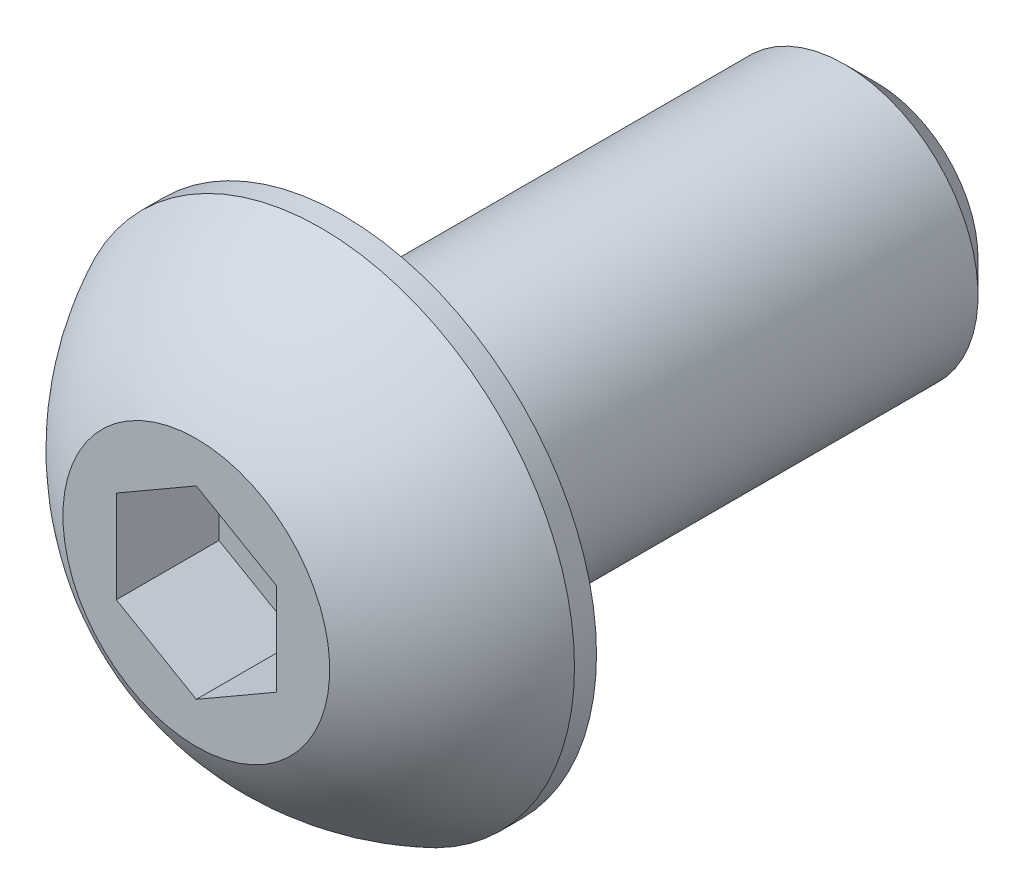
ISO-10303-21;
HEADER;
FILE_DESCRIPTION(('STEP AP214'),'2;1');
FILE_NAME('part.step','',(''),(''),'','','');
FILE_SCHEMA(('AUTOMOTIVE_DESIGN { 1 0 10303 214 1 1 1 1 }'));
ENDSEC;
DATA;
#1=APPLICATION_CONTEXT('core data for automotive mechanical design processes');
#2=APPLICATION_PROTOCOL_DEFINITION('international standard','automotive_design',2000,#1);
#3=PRODUCT_CONTEXT('',#1,'mechanical');
#4=PRODUCT('Part','Part','',(#3));
#5=PRODUCT_RELATED_PRODUCT_CATEGORY('part','',(#4));
#6=PRODUCT_DEFINITION_FORMATION('','',#4);
#7=PRODUCT_DEFINITION_CONTEXT('part definition',#1,'design');
#8=PRODUCT_DEFINITION('design','',#6,#7);
#9=PRODUCT_DEFINITION_SHAPE('','',#8);
#10=(LENGTH_UNIT() NAMED_UNIT(*) SI_UNIT(.MILLI.,.METRE.));
#11=(NAMED_UNIT(*) PLANE_ANGLE_UNIT() SI_UNIT($,.RADIAN.));
#12=(NAMED_UNIT(*) SI_UNIT($,.STERADIAN.) SOLID_ANGLE_UNIT());
#13=UNCERTAINTY_MEASURE_WITH_UNIT(LENGTH_MEASURE(1.E-05),#10,'distance_accuracy_value','');
#14=(GEOMETRIC_REPRESENTATION_CONTEXT(3) GLOBAL_UNCERTAINTY_ASSIGNED_CONTEXT((#13)) GLOBAL_UNIT_ASSIGNED_CONTEXT((#10,
#11,#12)) REPRESENTATION_CONTEXT('',''));
#15=CARTESIAN_POINT('',(0.,0.,0.));
#16=DIRECTION('',(0.,0.,1.));
#17=DIRECTION('',(1.,0.,0.));
#18=AXIS2_PLACEMENT_3D('',#15,#16,#17);
#19=CARTESIAN_POINT('',(0.,-2.5,-12.75));
#20=DIRECTION('',(0.,0.,-1.));
#21=DIRECTION('',(0.,1.,0.));
#22=AXIS2_PLACEMENT_3D('',#19,#20,#21);
#23=PLANE('',#22);
#24=CARTESIAN_POINT('',(0.,0.,-12.75));
#25=DIRECTION('',(0.,0.,-1.));
#26=DIRECTION('',(0.,1.,0.));
#27=AXIS2_PLACEMENT_3D('',#24,#25,#26);
#28=CIRCLE('',#27,1.9);
#29=CARTESIAN_POINT('',(0.,1.9,-12.75));
#30=VERTEX_POINT('',#29);
#31=EDGE_CURVE('E44',#30,#30,#28,.T.);
#32=ORIENTED_EDGE('',*,*,#31,.T.);
#33=EDGE_LOOP('',(#32));
#34=FACE_BOUND('',#33,.T.);
#35=ADVANCED_FACE('F36',(#34),#23,.T.);
#36=CARTESIAN_POINT('',(0.,0.,-12.75));
#37=DIRECTION('',(0.,0.,-1.));
#38=DIRECTION('',(0.,1.,0.));
#39=AXIS2_PLACEMENT_3D('',#36,#37,#38);
#40=CYLINDRICAL_SURFACE('',#39,2.5);
#41=CARTESIAN_POINT('',(0.,0.,-12.15));
#42=DIRECTION('',(0.,0.,-1.));
#43=DIRECTION('',(0.,1.,0.));
#44=AXIS2_PLACEMENT_3D('',#41,#42,#43);
#45=CIRCLE('',#44,2.5);
#46=CARTESIAN_POINT('',(0.,2.5,-12.15));
#47=VERTEX_POINT('',#46);
#48=EDGE_CURVE('E11',#47,#47,#45,.F.);
#49=ORIENTED_EDGE('',*,*,#48,.T.);
#50=EDGE_LOOP('',(#49));
#51=FACE_BOUND('',#50,.T.);
#52=CARTESIAN_POINT('',(0.,0.,-2.75));
#53=DIRECTION('',(0.,0.,1.));
#54=DIRECTION('',(1.,0.,0.));
#55=AXIS2_PLACEMENT_3D('',#52,#53,#54);
#56=CIRCLE('',#55,2.5);
#57=CARTESIAN_POINT('',(2.5,0.,-2.75));
#58=VERTEX_POINT('',#57);
#59=EDGE_CURVE('E152',#58,#58,#56,.F.);
#60=ORIENTED_EDGE('',*,*,#59,.T.);
#61=EDGE_LOOP('',(#60));
#62=FACE_BOUND('',#61,.T.);
#63=ADVANCED_FACE('F160',(#51,#62),#40,.T.);
#64=CARTESIAN_POINT('',(0.,0.,-12.75));
#65=DIRECTION('',(0.,0.,1.));
#66=DIRECTION('',(0.,-1.,0.));
#67=AXIS2_PLACEMENT_3D('',#64,#65,#66);
#68=CONICAL_SURFACE('',#67,1.9,0.785398163397447);
#69=ORIENTED_EDGE('',*,*,#48,.F.);
#70=EDGE_LOOP('',(#69));
#71=FACE_BOUND('',#70,.T.);
#72=ORIENTED_EDGE('',*,*,#31,.F.);
#73=EDGE_LOOP('',(#72));
#74=FACE_BOUND('',#73,.T.);
#75=ADVANCED_FACE('F38',(#71,#74),#68,.T.);
#76=CARTESIAN_POINT('',(0.,0.,-4.65805481283422));
#77=DIRECTION('',(0.,0.,1.));
#78=DIRECTION('',(0.,-1.,0.));
#79=AXIS2_PLACEMENT_3D('',#76,#77,#78);
#80=SPHERICAL_SURFACE('',#79,5.28653711226622);
#81=CARTESIAN_POINT('',(0.,0.,0.));
#82=DIRECTION('',(0.,0.,1.));
#83=DIRECTION('',(1.,0.,0.));
#84=AXIS2_PLACEMENT_3D('',#81,#82,#83);
#85=CIRCLE('',#84,2.5);
#86=CARTESIAN_POINT('',(0.,-2.5,0.));
#87=VERTEX_POINT('',#86);
#88=EDGE_CURVE('E149',#87,#87,#85,.T.);
#89=CARTESIAN_POINT('',(0.,0.,-2.3375));
#90=DIRECTION('',(0.,0.,1.));
#91=DIRECTION('',(1.,0.,0.));
#92=AXIS2_PLACEMENT_3D('',#89,#90,#91);
#93=CIRCLE('',#92,4.75);
#94=CARTESIAN_POINT('',(0.,-4.75,-2.3375));
#95=VERTEX_POINT('',#94);
#96=EDGE_CURVE('E138',#95,#95,#93,.T.);
#97=CARTESIAN_POINT('',(0.,-2.5,0.));
#98=CARTESIAN_POINT('',(0.,-2.53026679982017,-0.016244282455609));
#99=CARTESIAN_POINT('',(0.,-2.56037522904968,-0.0327836412064128));
#100=CARTESIAN_POINT('',(0.,-2.62026400427657,-0.0664460518821871));
#101=CARTESIAN_POINT('',(0.,-2.65004435027396,-0.0835691038071575));
#102=CARTESIAN_POINT('',(0.,-2.70926561698584,-0.11839244141504));
#103=CARTESIAN_POINT('',(0.,-2.73870653770032,-0.136092727097952));
#104=CARTESIAN_POINT('',(0.,-2.79723777417103,-0.172063794044945));
#105=CARTESIAN_POINT('',(0.,-2.82632808992726,-0.190334575309027));
#106=CARTESIAN_POINT('',(0.,-2.8841470610759,-0.227439694392676));
#107=CARTESIAN_POINT('',(0.,-2.91287571646831,-0.246274032212244));
#108=CARTESIAN_POINT('',(0.,-2.96996045130294,-0.284499106978588));
#109=CARTESIAN_POINT('',(0.,-2.99831653074515,-0.303889843925365));
#110=CARTESIAN_POINT('',(0.,-3.05464533901892,-0.343220349244854));
#111=CARTESIAN_POINT('',(0.,-3.08261806785047,-0.363160117617566));
#112=CARTESIAN_POINT('',(0.,-3.13816954607727,-0.403581109164589));
#113=CARTESIAN_POINT('',(0.,-3.16574829547251,-0.424062332338901));
#114=CARTESIAN_POINT('',(0.,-3.22050133565615,-0.465558451209038));
#115=CARTESIAN_POINT('',(0.,-3.24767562644455,-0.486573346904865));
#116=CARTESIAN_POINT('',(0.,-3.30160942393942,-0.529128825735185));
#117=CARTESIAN_POINT('',(0.,-3.32836893064589,-0.550669408869678));
#118=CARTESIAN_POINT('',(0.,-3.38146299210494,-0.594268077753708));
#119=CARTESIAN_POINT('',(0.,-3.40779754685753,-0.616326163503246));
#120=CARTESIAN_POINT('',(0.,-3.46003169800773,-0.660951456155511));
#121=CARTESIAN_POINT('',(0.,-3.48593129440535,-0.683518663058237));
#122=CARTESIAN_POINT('',(0.,-3.53728568771641,-0.729153623103509));
#123=CARTESIAN_POINT('',(0.,-3.56274048462986,-0.752221376246055));
#124=CARTESIAN_POINT('',(0.,-3.61319560685493,-0.798848663663778));
#125=CARTESIAN_POINT('',(0.,-3.63819593216655,-0.822408197938956));
#126=CARTESIAN_POINT('',(0.,-3.68773261175691,-0.870010095651582));
#127=CARTESIAN_POINT('',(0.,-3.71226896603565,-0.89405245908903));
#128=CARTESIAN_POINT('',(0.,-3.76086838042534,-0.942610879694118));
#129=CARTESIAN_POINT('',(0.,-3.78493144053629,-0.967126936861757));
#130=CARTESIAN_POINT('',(0.,-3.83257512329416,-1.01662342950466));
#131=CARTESIAN_POINT('',(0.,-3.85615574594108,-1.04160386497992));
#132=CARTESIAN_POINT('',(0.,-3.90282559378753,-1.0920196223646));
#133=CARTESIAN_POINT('',(0.,-3.92591481898706,-1.11745494427402));
#134=CARTESIAN_POINT('',(0.,-3.97159309867276,-1.1687708098093));
#135=CARTESIAN_POINT('',(0.,-3.99418215315894,-1.19465135343517));
#136=CARTESIAN_POINT('',(0.,-4.03885150820303,-1.24684782851373));
#137=CARTESIAN_POINT('',(0.,-4.06093180876094,-1.27316375996643));
#138=CARTESIAN_POINT('',(0.,-4.10457526604591,-1.32622101137371));
#139=CARTESIAN_POINT('',(0.,-4.12613842277298,-1.3529623313283));
#140=CARTESIAN_POINT('',(0.,-4.16873939899418,-1.40686019877854));
#141=CARTESIAN_POINT('',(0.,-4.1897772184883,-1.4340167462742));
#142=CARTESIAN_POINT('',(0.,-4.23131952645464,-1.488734750071));
#143=CARTESIAN_POINT('',(0.,-4.25182401492686,-1.51629620637214));
#144=CARTESIAN_POINT('',(0.,-4.29229186971308,-1.5718135551894));
#145=CARTESIAN_POINT('',(0.,-4.31225523602708,-1.59976944770551));
#146=CARTESIAN_POINT('',(0.,-4.35163326096594,-1.65606504649041));
#147=CARTESIAN_POINT('',(0.,-4.3710479195908,-1.6844047527592));
#148=CARTESIAN_POINT('',(0.,-4.40932115213664,-1.74145721073709));
#149=CARTESIAN_POINT('',(0.,-4.42817972605763,-1.77016996244618));
#150=CARTESIAN_POINT('',(0.,-4.46533362339398,-1.82795760128832));
#151=CARTESIAN_POINT('',(0.,-4.48362894680934,-1.85703248842136));
#152=CARTESIAN_POINT('',(0.,-4.51964939166499,-1.91553335033324));
#153=CARTESIAN_POINT('',(0.,-4.53737451310527,-1.94495932511208));
#154=CARTESIAN_POINT('',(0.,-4.57224781803529,-2.00415118173237));
#155=CARTESIAN_POINT('',(0.,-4.58939600152503,-2.03391706357382));
#156=CARTESIAN_POINT('',(0.,-4.62310891815402,-2.09377742234707));
#157=CARTESIAN_POINT('',(0.,-4.63967365129327,-2.12387189927887));
#158=CARTESIAN_POINT('',(0.,-4.67221336026297,-2.18437801974018));
#159=CARTESIAN_POINT('',(0.,-4.68818833609342,-2.21478966326969));
#160=CARTESIAN_POINT('',(0.,-4.71954250823692,-2.27591853680649));
#161=CARTESIAN_POINT('',(0.,-4.73492170454996,-2.30663576681378));
#162=CARTESIAN_POINT('',(0.,-4.75,-2.3375));
#163=B_SPLINE_CURVE_WITH_KNOTS('',3,(#97,#98,#99,#100,#101,#102,#103,#104,#105,#106,#107,#108,
#109,#110,#111,#112,#113,#114,#115,#116,#117,#118,#119,#120,#121,#122,#123,#124,#125,#126,#127,
#128,#129,#130,#131,#132,#133,#134,#135,#136,#137,#138,#139,#140,#141,#142,#143,#144,#145,#146,
#147,#148,#149,#150,#151,#152,#153,#154,#155,#156,#157,#158,#159,#160,#161,#162),.UNSPECIFIED.,
.F.,.F.,(4,2,2,2,2,2,2,2,2,2,2,2,2,2,2,2,2,2,2,2,2,2,2,2,2,2,2,2,2,2,2,2,4),(0.,
0.10304982363783,0.206099647275662,0.309149470913491,0.412199294551322,0.515249118189152,
0.618298941826983,0.721348765464812,0.824398589102643,0.927448412740473,1.0304982363783,
1.13354806001613,1.23659788365396,1.33964770729179,1.44269753092962,1.54574735456745,
1.64879717820529,1.75184700184312,1.85489682548095,1.95794664911878,2.06099647275661,
2.16404629639444,2.26709612003227,2.3701459436701,2.47319576730793,2.57624559094576,
2.67929541458359,2.78234523822142,2.88539506185925,2.98844488549708,3.09149470913491,
3.19454453277274,3.29759435641057),.UNSPECIFIED.);
#164=EDGE_CURVE('BSEAM159',#87,#95,#163,.T.);
#165=ORIENTED_EDGE('',*,*,#88,.F.);
#166=ORIENTED_EDGE('',*,*,#96,.T.);
#167=ORIENTED_EDGE('',*,*,#164,.T.);
#168=ORIENTED_EDGE('',*,*,#164,.F.);
#169=EDGE_LOOP('',(#165,#167,#166,#168));
#170=FACE_BOUND('',#169,.T.);
#171=ADVANCED_FACE('F159',(#170),#80,.T.);
#172=CARTESIAN_POINT('',(0.,-2.5,0.));
#173=DIRECTION('',(0.,0.,-1.));
#174=DIRECTION('',(-1.,0.,0.));
#175=AXIS2_PLACEMENT_3D('',#172,#173,#174);
#176=PLANE('',#175);
#177=DIRECTION('',(0.,1.,0.));
#178=VECTOR('',#177,1.);
#179=CARTESIAN_POINT('',(1.5,-0.866025403784438,0.));
#180=LINE('',#179,#178);
#181=CARTESIAN_POINT('',(1.5,-0.866025403784439,0.));
#182=VERTEX_POINT('',#181);
#183=CARTESIAN_POINT('',(1.5,0.866025403784439,0.));
#184=VERTEX_POINT('',#183);
#185=EDGE_CURVE('E125',#182,#184,#180,.T.);
#186=ORIENTED_EDGE('',*,*,#185,.F.);
#187=DIRECTION('',(0.866025403784438,0.5,0.));
#188=VECTOR('',#187,1.);
#189=CARTESIAN_POINT('',(0.,-1.73205080756888,0.));
#190=LINE('',#189,#188);
#191=CARTESIAN_POINT('',(0.,-1.73205080756888,0.));
#192=VERTEX_POINT('',#191);
#193=EDGE_CURVE('E51',#192,#182,#190,.T.);
#194=ORIENTED_EDGE('',*,*,#193,.F.);
#195=DIRECTION('',(0.866025403784439,-0.5,0.));
#196=VECTOR('',#195,1.);
#197=CARTESIAN_POINT('',(-1.5,-0.866025403784439,0.));
#198=LINE('',#197,#196);
#199=CARTESIAN_POINT('',(-1.5,-0.866025403784439,0.));
#200=VERTEX_POINT('',#199);
#201=EDGE_CURVE('E134',#200,#192,#198,.T.);
#202=ORIENTED_EDGE('',*,*,#201,.F.);
#203=DIRECTION('',(0.,-1.,0.));
#204=VECTOR('',#203,1.);
#205=CARTESIAN_POINT('',(-1.5,0.866025403784438,0.));
#206=LINE('',#205,#204);
#207=CARTESIAN_POINT('',(-1.5,0.866025403784438,0.));
#208=VERTEX_POINT('',#207);
#209=EDGE_CURVE('E132',#208,#200,#206,.T.);
#210=ORIENTED_EDGE('',*,*,#209,.F.);
#211=DIRECTION('',(-0.866025403784438,-0.5,0.));
#212=VECTOR('',#211,1.);
#213=CARTESIAN_POINT('',(0.,1.73205080756888,0.));
#214=LINE('',#213,#212);
#215=CARTESIAN_POINT('',(0.,1.73205080756888,0.));
#216=VERTEX_POINT('',#215);
#217=EDGE_CURVE('E99',#216,#208,#214,.T.);
#218=ORIENTED_EDGE('',*,*,#217,.F.);
#219=DIRECTION('',(-0.866025403784439,0.5,0.));
#220=VECTOR('',#219,1.);
#221=CARTESIAN_POINT('',(1.5,0.866025403784439,0.));
#222=LINE('',#221,#220);
#223=EDGE_CURVE('E128',#184,#216,#222,.T.);
#224=ORIENTED_EDGE('',*,*,#223,.F.);
#225=EDGE_LOOP('',(#186,#194,#202,#210,#218,#224));
#226=FACE_BOUND('',#225,.T.);
#227=ORIENTED_EDGE('',*,*,#88,.T.);
#228=EDGE_LOOP('',(#227));
#229=FACE_BOUND('',#228,.T.);
#230=ADVANCED_FACE('F166',(#226,#229),#176,.F.);
#231=CARTESIAN_POINT('',(0.,-4.75,-2.75));
#232=DIRECTION('',(0.,0.,1.));
#233=DIRECTION('',(1.,0.,0.));
#234=AXIS2_PLACEMENT_3D('',#231,#232,#233);
#235=PLANE('',#234);
#236=ORIENTED_EDGE('',*,*,#59,.F.);
#237=EDGE_LOOP('',(#236));
#238=FACE_BOUND('',#237,.T.);
#239=CARTESIAN_POINT('',(0.,0.,-2.75));
#240=DIRECTION('',(0.,0.,1.));
#241=DIRECTION('',(1.,0.,0.));
#242=AXIS2_PLACEMENT_3D('',#239,#240,#241);
#243=CIRCLE('',#242,4.75);
#244=CARTESIAN_POINT('',(4.75,0.,-2.75));
#245=VERTEX_POINT('',#244);
#246=EDGE_CURVE('E146',#245,#245,#243,.T.);
#247=ORIENTED_EDGE('',*,*,#246,.F.);
#248=EDGE_LOOP('',(#247));
#249=FACE_BOUND('',#248,.T.);
#250=ADVANCED_FACE('F178',(#238,#249),#235,.F.);
#251=CARTESIAN_POINT('',(0.,0.,0.));
#252=DIRECTION('',(0.,0.,1.));
#253=DIRECTION('',(1.,0.,0.));
#254=AXIS2_PLACEMENT_3D('',#251,#252,#253);
#255=CYLINDRICAL_SURFACE('',#254,4.75);
#256=ORIENTED_EDGE('',*,*,#96,.F.);
#257=EDGE_LOOP('',(#256));
#258=FACE_BOUND('',#257,.T.);
#259=ORIENTED_EDGE('',*,*,#246,.T.);
#260=EDGE_LOOP('',(#259));
#261=FACE_BOUND('',#260,.T.);
#262=ADVANCED_FACE('F182',(#258,#261),#255,.T.);
#263=CARTESIAN_POINT('',(0.,-1.73205080756888,-1.925));
#264=DIRECTION('',(0.5,-0.866025403784438,0.));
#265=DIRECTION('',(0.866025403784438,0.5,0.));
#266=AXIS2_PLACEMENT_3D('',#263,#264,#265);
#267=PLANE('',#266);
#268=ORIENTED_EDGE('',*,*,#193,.T.);
#269=DIRECTION('',(0.,0.,1.));
#270=VECTOR('',#269,1.);
#271=CARTESIAN_POINT('',(1.5,-0.866025403784438,-1.925));
#272=LINE('',#271,#270);
#273=CARTESIAN_POINT('',(1.5,-0.866025403784438,-1.925));
#274=VERTEX_POINT('',#273);
#275=EDGE_CURVE('E81',#274,#182,#272,.T.);
#276=ORIENTED_EDGE('',*,*,#275,.F.);
#277=DIRECTION('',(0.866025403784438,0.5,0.));
#278=VECTOR('',#277,1.);
#279=CARTESIAN_POINT('',(0.,-1.73205080756888,-1.925));
#280=LINE('',#279,#278);
#281=CARTESIAN_POINT('',(0.,-1.73205080756888,-1.925));
#282=VERTEX_POINT('',#281);
#283=EDGE_CURVE('E136',#282,#274,#280,.T.);
#284=ORIENTED_EDGE('',*,*,#283,.F.);
#285=DIRECTION('',(0.,0.,1.));
#286=VECTOR('',#285,1.);
#287=CARTESIAN_POINT('',(0.,-1.73205080756888,-1.925));
#288=LINE('',#287,#286);
#289=EDGE_CURVE('E59',#282,#192,#288,.T.);
#290=ORIENTED_EDGE('',*,*,#289,.T.);
#291=EDGE_LOOP('',(#268,#276,#284,#290));
#292=FACE_BOUND('',#291,.T.);
#293=ADVANCED_FACE('F186',(#292),#267,.F.);
#294=CARTESIAN_POINT('',(-1.5,-0.866025403784439,-1.925));
#295=DIRECTION('',(-0.5,-0.866025403784439,0.));
#296=DIRECTION('',(0.866025403784439,-0.5,0.));
#297=AXIS2_PLACEMENT_3D('',#294,#295,#296);
#298=PLANE('',#297);
#299=ORIENTED_EDGE('',*,*,#201,.T.);
#300=ORIENTED_EDGE('',*,*,#289,.F.);
#301=DIRECTION('',(0.866025403784439,-0.5,0.));
#302=VECTOR('',#301,1.);
#303=CARTESIAN_POINT('',(-1.5,-0.866025403784439,-1.925));
#304=LINE('',#303,#302);
#305=CARTESIAN_POINT('',(-1.5,-0.866025403784439,-1.925));
#306=VERTEX_POINT('',#305);
#307=EDGE_CURVE('E111',#306,#282,#304,.T.);
#308=ORIENTED_EDGE('',*,*,#307,.F.);
#309=DIRECTION('',(0.,0.,1.));
#310=VECTOR('',#309,1.);
#311=CARTESIAN_POINT('',(-1.5,-0.866025403784439,-1.925));
#312=LINE('',#311,#310);
#313=EDGE_CURVE('E103',#306,#200,#312,.T.);
#314=ORIENTED_EDGE('',*,*,#313,.T.);
#315=EDGE_LOOP('',(#299,#300,#308,#314));
#316=FACE_BOUND('',#315,.T.);
#317=ADVANCED_FACE('F190',(#316),#298,.F.);
#318=CARTESIAN_POINT('',(-1.5,0.866025403784438,-1.925));
#319=DIRECTION('',(-1.,0.,0.));
#320=DIRECTION('',(0.,0.,1.));
#321=AXIS2_PLACEMENT_3D('',#318,#319,#320);
#322=PLANE('',#321);
#323=ORIENTED_EDGE('',*,*,#209,.T.);
#324=ORIENTED_EDGE('',*,*,#313,.F.);
#325=DIRECTION('',(0.,-1.,0.));
#326=VECTOR('',#325,1.);
#327=CARTESIAN_POINT('',(-1.5,0.866025403784438,-1.925));
#328=LINE('',#327,#326);
#329=CARTESIAN_POINT('',(-1.5,0.866025403784438,-1.925));
#330=VERTEX_POINT('',#329);
#331=EDGE_CURVE('E107',#330,#306,#328,.T.);
#332=ORIENTED_EDGE('',*,*,#331,.F.);
#333=DIRECTION('',(0.,0.,1.));
#334=VECTOR('',#333,1.);
#335=CARTESIAN_POINT('',(-1.5,0.866025403784438,-1.925));
#336=LINE('',#335,#334);
#337=EDGE_CURVE('E92',#330,#208,#336,.T.);
#338=ORIENTED_EDGE('',*,*,#337,.T.);
#339=EDGE_LOOP('',(#323,#324,#332,#338));
#340=FACE_BOUND('',#339,.T.);
#341=ADVANCED_FACE('F108',(#340),#322,.F.);
#342=CARTESIAN_POINT('',(0.,1.73205080756888,-1.925));
#343=DIRECTION('',(-0.5,0.866025403784438,0.));
#344=DIRECTION('',(-0.866025403784438,-0.5,0.));
#345=AXIS2_PLACEMENT_3D('',#342,#343,#344);
#346=PLANE('',#345);
#347=ORIENTED_EDGE('',*,*,#217,.T.);
#348=ORIENTED_EDGE('',*,*,#337,.F.);
#349=DIRECTION('',(-0.866025403784438,-0.5,0.));
#350=VECTOR('',#349,1.);
#351=CARTESIAN_POINT('',(0.,1.73205080756888,-1.925));
#352=LINE('',#351,#350);
#353=CARTESIAN_POINT('',(0.,1.73205080756888,-1.925));
#354=VERTEX_POINT('',#353);
#355=EDGE_CURVE('E96',#354,#330,#352,.T.);
#356=ORIENTED_EDGE('',*,*,#355,.F.);
#357=DIRECTION('',(0.,0.,1.));
#358=VECTOR('',#357,1.);
#359=CARTESIAN_POINT('',(0.,1.73205080756888,-1.925));
#360=LINE('',#359,#358);
#361=EDGE_CURVE('E104',#354,#216,#360,.T.);
#362=ORIENTED_EDGE('',*,*,#361,.T.);
#363=EDGE_LOOP('',(#347,#348,#356,#362));
#364=FACE_BOUND('',#363,.T.);
#365=ADVANCED_FACE('F94',(#364),#346,.F.);
#366=CARTESIAN_POINT('',(1.5,0.866025403784439,-1.925));
#367=DIRECTION('',(0.5,0.866025403784439,0.));
#368=DIRECTION('',(-0.866025403784439,0.5,0.));
#369=AXIS2_PLACEMENT_3D('',#366,#367,#368);
#370=PLANE('',#369);
#371=ORIENTED_EDGE('',*,*,#223,.T.);
#372=ORIENTED_EDGE('',*,*,#361,.F.);
#373=DIRECTION('',(-0.866025403784439,0.5,0.));
#374=VECTOR('',#373,1.);
#375=CARTESIAN_POINT('',(1.5,0.866025403784439,-1.925));
#376=LINE('',#375,#374);
#377=CARTESIAN_POINT('',(1.5,0.866025403784439,-1.925));
#378=VERTEX_POINT('',#377);
#379=EDGE_CURVE('E117',#378,#354,#376,.T.);
#380=ORIENTED_EDGE('',*,*,#379,.F.);
#381=DIRECTION('',(0.,0.,1.));
#382=VECTOR('',#381,1.);
#383=CARTESIAN_POINT('',(1.5,0.866025403784439,-1.925));
#384=LINE('',#383,#382);
#385=EDGE_CURVE('E141',#378,#184,#384,.T.);
#386=ORIENTED_EDGE('',*,*,#385,.T.);
#387=EDGE_LOOP('',(#371,#372,#380,#386));
#388=FACE_BOUND('',#387,.T.);
#389=ADVANCED_FACE('F194',(#388),#370,.F.);
#390=CARTESIAN_POINT('',(1.5,-0.866025403784438,-1.925));
#391=DIRECTION('',(1.,0.,0.));
#392=DIRECTION('',(0.,0.,-1.));
#393=AXIS2_PLACEMENT_3D('',#390,#391,#392);
#394=PLANE('',#393);
#395=ORIENTED_EDGE('',*,*,#185,.T.);
#396=ORIENTED_EDGE('',*,*,#385,.F.);
#397=DIRECTION('',(0.,1.,0.));
#398=VECTOR('',#397,1.);
#399=CARTESIAN_POINT('',(1.5,-0.866025403784438,-1.925));
#400=LINE('',#399,#398);
#401=EDGE_CURVE('E119',#274,#378,#400,.T.);
#402=ORIENTED_EDGE('',*,*,#401,.F.);
#403=ORIENTED_EDGE('',*,*,#275,.T.);
#404=EDGE_LOOP('',(#395,#396,#402,#403));
#405=FACE_BOUND('',#404,.T.);
#406=ADVANCED_FACE('F191',(#405),#394,.F.);
#407=CARTESIAN_POINT('',(1.5,-0.866025403784438,-1.925));
#408=DIRECTION('',(0.,0.,1.));
#409=DIRECTION('',(1.,0.,0.));
#410=AXIS2_PLACEMENT_3D('',#407,#408,#409);
#411=PLANE('',#410);
#412=ORIENTED_EDGE('',*,*,#283,.T.);
#413=ORIENTED_EDGE('',*,*,#401,.T.);
#414=ORIENTED_EDGE('',*,*,#379,.T.);
#415=ORIENTED_EDGE('',*,*,#355,.T.);
#416=ORIENTED_EDGE('',*,*,#331,.T.);
#417=ORIENTED_EDGE('',*,*,#307,.T.);
#418=EDGE_LOOP('',(#412,#413,#414,#415,#416,#417));
#419=FACE_BOUND('',#418,.T.);
#420=ADVANCED_FACE('F114',(#419),#411,.T.);
#421=CLOSED_SHELL('',(#35,#63,#75,#171,#230,#250,#262,#293,#317,#341,#365,#389,#406,#420));
#422=MANIFOLD_SOLID_BREP('B2',#421);
#423=ADVANCED_BREP_SHAPE_REPRESENTATION('',(#18,#422),#14);
#424=SHAPE_DEFINITION_REPRESENTATION(#9,#423);
ENDSEC;
END-ISO-10303-21;
